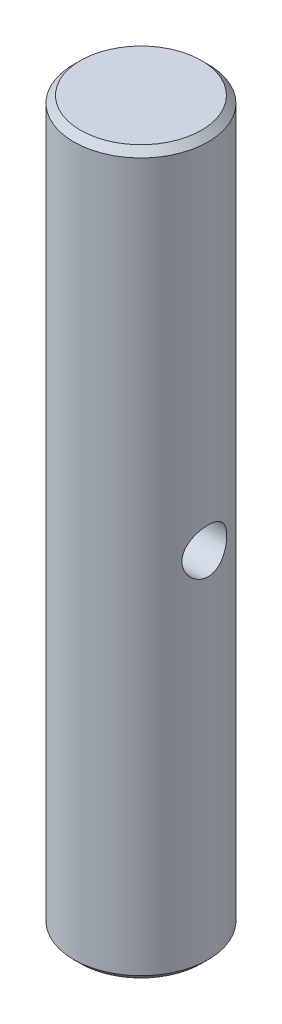
ISO-10303-21;
HEADER;
FILE_DESCRIPTION(('STEP AP214'),'2;1');
FILE_NAME('part.step','',(''),(''),'','','');
FILE_SCHEMA(('AUTOMOTIVE_DESIGN { 1 0 10303 214 1 1 1 1 }'));
ENDSEC;
DATA;
#1=APPLICATION_CONTEXT('core data for automotive mechanical design processes');
#2=APPLICATION_PROTOCOL_DEFINITION('international standard','automotive_design',2000,#1);
#3=PRODUCT_CONTEXT('',#1,'mechanical');
#4=PRODUCT('Part','Part','',(#3));
#5=PRODUCT_RELATED_PRODUCT_CATEGORY('part','',(#4));
#6=PRODUCT_DEFINITION_FORMATION('','',#4);
#7=PRODUCT_DEFINITION_CONTEXT('part definition',#1,'design');
#8=PRODUCT_DEFINITION('design','',#6,#7);
#9=PRODUCT_DEFINITION_SHAPE('','',#8);
#10=(LENGTH_UNIT() NAMED_UNIT(*) SI_UNIT(.MILLI.,.METRE.));
#11=(NAMED_UNIT(*) PLANE_ANGLE_UNIT() SI_UNIT($,.RADIAN.));
#12=(NAMED_UNIT(*) SI_UNIT($,.STERADIAN.) SOLID_ANGLE_UNIT());
#13=UNCERTAINTY_MEASURE_WITH_UNIT(LENGTH_MEASURE(1.E-05),#10,'distance_accuracy_value','');
#14=(GEOMETRIC_REPRESENTATION_CONTEXT(3) GLOBAL_UNCERTAINTY_ASSIGNED_CONTEXT((#13)) GLOBAL_UNIT_ASSIGNED_CONTEXT((#10,
#11,#12)) REPRESENTATION_CONTEXT('',''));
#15=CARTESIAN_POINT('',(0.,0.,0.));
#16=DIRECTION('',(0.,0.,1.));
#17=DIRECTION('',(1.,0.,0.));
#18=AXIS2_PLACEMENT_3D('',#15,#16,#17);
#19=CARTESIAN_POINT('',(0.,80.5,0.));
#20=DIRECTION('',(0.,-1.,0.));
#21=DIRECTION('',(0.,0.,-1.));
#22=AXIS2_PLACEMENT_3D('',#19,#20,#21);
#23=CYLINDRICAL_SURFACE('',#22,7.495);
#24=CARTESIAN_POINT('',(0.,0.750000000000015,0.));
#25=DIRECTION('',(0.,1.,0.));
#26=DIRECTION('',(0.,0.,1.));
#27=AXIS2_PLACEMENT_3D('',#24,#25,#26);
#28=CIRCLE('',#27,7.495);
#29=CARTESIAN_POINT('',(0.,0.750000000000015,7.495));
#30=VERTEX_POINT('',#29);
#31=EDGE_CURVE('E59',#30,#30,#28,.T.);
#32=ORIENTED_EDGE('',*,*,#31,.T.);
#33=EDGE_LOOP('',(#32));
#34=FACE_BOUND('',#33,.T.);
#35=CARTESIAN_POINT('',(0.,79.75,0.));
#36=DIRECTION('',(0.,1.,0.));
#37=DIRECTION('',(0.,0.,1.));
#38=AXIS2_PLACEMENT_3D('',#35,#36,#37);
#39=CIRCLE('',#38,7.495);
#40=CARTESIAN_POINT('',(0.,79.75,7.495));
#41=VERTEX_POINT('',#40);
#42=EDGE_CURVE('E64',#41,#41,#39,.F.);
#43=ORIENTED_EDGE('',*,*,#42,.T.);
#44=EDGE_LOOP('',(#43));
#45=FACE_BOUND('',#44,.T.);
#46=CARTESIAN_POINT('',(-7.495,37.75,0.));
#47=CARTESIAN_POINT('',(-7.49500039565531,37.7499993475431,-0.136403250609136));
#48=CARTESIAN_POINT('',(-7.49124202553133,37.7611998126953,-0.272802527120755));
#49=CARTESIAN_POINT('',(-7.47661940882001,37.805568395152,-0.541583183667757));
#50=CARTESIAN_POINT('',(-7.4657544339269,37.8387387640012,-0.673964150439741));
#51=CARTESIAN_POINT('',(-7.43809909299872,37.9257834362061,-0.930794409536697));
#52=CARTESIAN_POINT('',(-7.42131864383307,37.9796231023296,-1.05525656746104));
#53=CARTESIAN_POINT('',(-7.38354494520433,38.1063214058876,-1.29338434155467));
#54=CARTESIAN_POINT('',(-7.36255086316938,38.1791838028814,-1.4070478174622));
#55=CARTESIAN_POINT('',(-7.31774496789562,38.3445125147862,-1.6242929207204));
#56=CARTESIAN_POINT('',(-7.29386559549508,38.4375203683709,-1.7274484098229));
#57=CARTESIAN_POINT('',(-7.24635197972573,38.6393484438588,-1.91702313950987));
#58=CARTESIAN_POINT('',(-7.22271779151966,38.74817214483,-2.00343868796788));
#59=CARTESIAN_POINT('',(-7.17762688928455,38.9823809733002,-2.15951452446902));
#60=CARTESIAN_POINT('',(-7.15625248553374,39.1081527951714,-2.22862060979651));
#61=CARTESIAN_POINT('',(-7.11912858064474,39.3703614687983,-2.34451785614898));
#62=CARTESIAN_POINT('',(-7.10337736073673,39.5067950461376,-2.39131583728808));
#63=CARTESIAN_POINT('',(-7.07999469504405,39.7816084753698,-2.45966939771876));
#64=CARTESIAN_POINT('',(-7.07210717097534,39.9197672696434,-2.48202353193154));
#65=CARTESIAN_POINT('',(-7.0645875935002,40.1980823940866,-2.50335119104385));
#66=CARTESIAN_POINT('',(-7.06495298501804,40.3382380925919,-2.50233195226192));
#67=CARTESIAN_POINT('',(-7.07367356144509,40.6097551458046,-2.4775617832234));
#68=CARTESIAN_POINT('',(-7.08166231159511,40.7412254182891,-2.45485335071247));
#69=CARTESIAN_POINT('',(-7.10412982523248,40.9983706891034,-2.38905018795952));
#70=CARTESIAN_POINT('',(-7.11860936671825,41.1240449907251,-2.34595301385037));
#71=CARTESIAN_POINT('',(-7.15268788708642,41.3683981832486,-2.23991385200565));
#72=CARTESIAN_POINT('',(-7.17236562809782,41.4869316526036,-2.17666316736084));
#73=CARTESIAN_POINT('',(-7.21459040212254,41.7120318201852,-2.03232675645534));
#74=CARTESIAN_POINT('',(-7.23713826400811,41.8185950446809,-1.95123587311427));
#75=CARTESIAN_POINT('',(-7.28400398405308,42.0225872545359,-1.76851532622977));
#76=CARTESIAN_POINT('',(-7.3083527488286,42.1192474086212,-1.66603351202204));
#77=CARTESIAN_POINT('',(-7.35504563032165,42.2942104011091,-1.44601532622199));
#78=CARTESIAN_POINT('',(-7.37738955413792,42.3725114742091,-1.32847750861073));
#79=CARTESIAN_POINT('',(-7.41784918989191,42.5091537539704,-1.08005142286218));
#80=CARTESIAN_POINT('',(-7.43592064115018,42.5672887098801,-0.949042006439704));
#81=CARTESIAN_POINT('',(-7.46547779062344,42.6604565461127,-0.678356164359914));
#82=CARTESIAN_POINT('',(-7.47696577954708,42.6954974626196,-0.538682772093433));
#83=CARTESIAN_POINT('',(-7.49168203239221,42.7401198611464,-0.261142306321947));
#84=CARTESIAN_POINT('',(-7.49524711338938,42.7507402294888,-0.123459898112307));
#85=CARTESIAN_POINT('',(-7.49472619628961,42.7491797522535,0.151747325850034));
#86=CARTESIAN_POINT('',(-7.49064149160616,42.7370027612168,0.289272164310523));
#87=CARTESIAN_POINT('',(-7.47550226197524,42.6910150938463,0.556100709182818));
#88=CARTESIAN_POINT('',(-7.46465338508686,42.6578423081321,0.685527173003408));
#89=CARTESIAN_POINT('',(-7.43728433435304,42.5716024573964,0.936925356850375));
#90=CARTESIAN_POINT('',(-7.42076343713239,42.5185328547756,1.05889612368369));
#91=CARTESIAN_POINT('',(-7.38318641458212,42.3924571906792,1.29549957426582));
#92=CARTESIAN_POINT('',(-7.36202235541093,42.318963112025,1.40985458269083));
#93=CARTESIAN_POINT('',(-7.31755810689061,42.1546979886082,1.62494647569878));
#94=CARTESIAN_POINT('',(-7.29425726551546,42.0639216611196,1.72567918015936));
#95=CARTESIAN_POINT('',(-7.24680155790143,41.8627836195018,1.91543717007265));
#96=CARTESIAN_POINT('',(-7.22265607296265,41.7517186922413,2.00372121182836));
#97=CARTESIAN_POINT('',(-7.17732452119729,41.5158327726645,2.16049046495325));
#98=CARTESIAN_POINT('',(-7.15613847996424,41.3910116614004,2.22897550510456));
#99=CARTESIAN_POINT('',(-7.11933100196057,41.1310984054223,2.34388694582545));
#100=CARTESIAN_POINT('',(-7.10369846070152,40.9960274200524,2.39035742835481));
#101=CARTESIAN_POINT('',(-7.0799966164816,40.7193351121137,2.45968318315295));
#102=CARTESIAN_POINT('',(-7.07192390042893,40.5777167758617,2.48254911282648));
#103=CARTESIAN_POINT('',(-7.06464418608981,40.2997876035332,2.50318491056864));
#104=CARTESIAN_POINT('',(-7.06500248050563,40.1635785003749,2.50218525976918));
#105=CARTESIAN_POINT('',(-7.07346944390389,39.893377080663,2.47814722342207));
#106=CARTESIAN_POINT('',(-7.08157765042908,39.7593846323212,2.45511015290403));
#107=CARTESIAN_POINT('',(-7.10430697185424,39.4999593088065,2.38852265250878));
#108=CARTESIAN_POINT('',(-7.11880111522782,39.3744120211648,2.34537123105761));
#109=CARTESIAN_POINT('',(-7.15262215966858,39.132243480001,2.24010341320802));
#110=CARTESIAN_POINT('',(-7.17195013417403,39.0156242166288,2.17798280368561));
#111=CARTESIAN_POINT('',(-7.21431366189938,38.7891002781729,2.03337362171154));
#112=CARTESIAN_POINT('',(-7.23747429225665,38.6797114557464,1.95011384915057));
#113=CARTESIAN_POINT('',(-7.28436994106761,38.476060688924,1.76689301877659));
#114=CARTESIAN_POINT('',(-7.30810512039808,38.3818030390629,1.66692723583099));
#115=CARTESIAN_POINT('',(-7.35458808165459,38.2073807635579,1.44844508549721));
#116=CARTESIAN_POINT('',(-7.37726112501435,38.1279101050329,1.32935680553727));
#117=CARTESIAN_POINT('',(-7.4180437841934,37.9902013360198,1.07876542219285));
#118=CARTESIAN_POINT('',(-7.43615455915789,37.9319578306203,0.94726548396046));
#119=CARTESIAN_POINT('',(-7.46508892700444,37.8407849450904,0.681562196295865));
#120=CARTESIAN_POINT('',(-7.47619944556791,37.8068497079358,0.547735781087238));
#121=CARTESIAN_POINT('',(-7.49115377480986,37.7614606812882,0.275937448740938));
#122=CARTESIAN_POINT('',(-7.49499959980972,37.7500006599353,0.137966691509938));
#123=CARTESIAN_POINT('',(-7.495,37.75,0.));
#124=B_SPLINE_CURVE_WITH_KNOTS('',3,(#46,#47,#48,#49,#50,#51,#52,#53,#54,#55,#56,#57,#58,#59,
#60,#61,#62,#63,#64,#65,#66,#67,#68,#69,#70,#71,#72,#73,#74,#75,#76,#77,#78,#79,#80,#81,#82,#83,
#84,#85,#86,#87,#88,#89,#90,#91,#92,#93,#94,#95,#96,#97,#98,#99,#100,#101,#102,#103,#104,#105,
#106,#107,#108,#109,#110,#111,#112,#113,#114,#115,#116,#117,#118,#119,#120,#121,#122,#123),
.UNSPECIFIED.,.T.,.F.,(4,2,2,2,2,2,2,2,2,2,2,2,2,2,2,2,2,2,2,2,2,2,2,2,2,2,2,2,2,2,2,2,2,2,2,2,
2,2,4),(0.,0.40870203817066,0.817445967892821,1.22550790100636,1.63365054260894,
2.05454956517894,2.47554131492762,2.90865713703534,3.34164046035242,3.76001197515197,
4.17825396527142,4.57735424663798,4.9765023777096,5.38208472266918,5.78778446404979,
6.21469488453949,6.64164633743611,7.07284393497927,7.50389140654312,7.91623240741195,
8.32850369662022,8.72881408232289,9.12917554017089,9.54007575277906,9.95110176895632,
10.3808297494757,10.8105614460871,11.239428972036,11.6681027804197,12.0747247664217,
12.4813224897559,12.8801770218289,13.2791202054223,13.695490563237,14.1119788872947,
14.5447291545869,14.9773693609554,15.3908705730491,15.8042571145572),.UNSPECIFIED.);
#125=CARTESIAN_POINT('',(-7.495,37.75,0.));
#126=VERTEX_POINT('',#125);
#127=EDGE_CURVE('E70',#126,#126,#124,.T.);
#128=ORIENTED_EDGE('',*,*,#127,.T.);
#129=EDGE_LOOP('',(#128));
#130=FACE_BOUND('',#129,.T.);
#131=CARTESIAN_POINT('',(7.06576428986985,40.25,-2.5));
#132=CARTESIAN_POINT('',(7.0657638249131,40.1138353486714,-2.50000066362457));
#133=CARTESIAN_POINT('',(7.06974335597971,39.9776747189488,-2.48883791001409));
#134=CARTESIAN_POINT('',(7.08514864170734,39.7093877235982,-2.44463272735069));
#135=CARTESIAN_POINT('',(7.09657561467055,39.5772620217334,-2.41158671847479));
#136=CARTESIAN_POINT('',(7.12544058293644,39.3209749881567,-2.32490516495711));
#137=CARTESIAN_POINT('',(7.14286677809783,39.1967985850399,-2.27131001598819));
#138=CARTESIAN_POINT('',(7.18174951835662,38.9591595961731,-2.14518949792188));
#139=CARTESIAN_POINT('',(7.20320695425731,38.8456993867769,-2.07265994341225));
#140=CARTESIAN_POINT('',(7.24867725880278,38.6282681876395,-1.90768556996842));
#141=CARTESIAN_POINT('',(7.27275387320441,38.5247782393971,-1.81462416717895));
#142=CARTESIAN_POINT('',(7.32021090555531,38.3345458563827,-1.61254360835079));
#143=CARTESIAN_POINT('',(7.34359121102593,38.2478061150869,-1.50352189079965));
#144=CARTESIAN_POINT('',(7.38775946665619,38.0913529529184,-1.2690969922347));
#145=CARTESIAN_POINT('',(7.40846371507817,38.022143653469,-1.14334020120049));
#146=CARTESIAN_POINT('',(7.44419586373357,37.906051828611,-0.881160591084556));
#147=CARTESIAN_POINT('',(7.45922529571979,37.8591632774687,-0.74474066222611));
#148=CARTESIAN_POINT('',(7.48146286131244,37.7906755197199,-0.470150891741198));
#149=CARTESIAN_POINT('',(7.4889252198773,37.7682522312938,-0.332207563932205));
#150=CARTESIAN_POINT('',(7.49609030598823,37.7467111283003,-0.0543279448844862));
#151=CARTESIAN_POINT('',(7.49579503617113,37.7475872989631,0.0856078226818821));
#152=CARTESIAN_POINT('',(7.48765034999541,37.7720977708136,0.357666666584124));
#153=CARTESIAN_POINT('',(7.48009806003232,37.7948369496504,0.489880739484106));
#154=CARTESIAN_POINT('',(7.4586610507061,37.8609475549255,0.748495711587776));
#155=CARTESIAN_POINT('',(7.44477590202233,37.9043203801797,0.874896216035203));
#156=CARTESIAN_POINT('',(7.41185515005991,38.0109891825239,1.12025209520925));
#157=CARTESIAN_POINT('',(7.39275420514729,38.0745397047006,1.23908767700572));
#158=CARTESIAN_POINT('',(7.35138975525784,38.2195500348621,1.46467246163601));
#159=CARTESIAN_POINT('',(7.32912537066374,38.3010148275015,1.57141828793993));
#160=CARTESIAN_POINT('',(7.28254196420155,38.484050760255,1.77511749844454));
#161=CARTESIAN_POINT('',(7.25817556221889,38.5863886912503,1.87137204724271));
#162=CARTESIAN_POINT('',(7.21101902945478,38.8059607289922,2.04557930233335));
#163=CARTESIAN_POINT('',(7.18822914265605,38.9231971335084,2.12352918023092));
#164=CARTESIAN_POINT('',(7.14654651176829,39.1714556562888,2.25988371021088));
#165=CARTESIAN_POINT('',(7.12771412183756,39.3026508556494,2.31799309450249));
#166=CARTESIAN_POINT('',(7.09677790884438,39.5737501877954,2.41105823153615));
#167=CARTESIAN_POINT('',(7.08467126166414,39.7136506377918,2.44602370351534));
#168=CARTESIAN_POINT('',(7.06919649298177,39.9914194542844,2.49038474996967));
#169=CARTESIAN_POINT('',(7.06545835909857,40.1290941743889,2.50086396016862));
#170=CARTESIAN_POINT('',(7.06610957550233,40.4042569020076,2.49902480943983));
#171=CARTESIAN_POINT('',(7.07049744707572,40.5417449389369,2.48671059629991));
#172=CARTESIAN_POINT('',(7.08653737214327,40.8076984524668,2.44060788060447));
#173=CARTESIAN_POINT('',(7.09793424979986,40.9363116017635,2.40757294763833));
#174=CARTESIAN_POINT('',(7.12642723414446,41.1861432086363,2.32187103564908));
#175=CARTESIAN_POINT('',(7.14352435197788,41.3073603497444,2.26920057335292));
#176=CARTESIAN_POINT('',(7.18216354797652,41.5432243116644,2.14382212524103));
#177=CARTESIAN_POINT('',(7.20382951821319,41.6575403322883,2.07053104543611));
#178=CARTESIAN_POINT('',(7.24892494119859,41.8726430741348,1.90665244660716));
#179=CARTESIAN_POINT('',(7.27235491322546,41.9734257869941,1.81605982228464));
#180=CARTESIAN_POINT('',(7.31970404970355,42.1636203800063,1.61496581095641));
#181=CARTESIAN_POINT('',(7.34359238440693,42.2522503370852,1.50371544557538));
#182=CARTESIAN_POINT('',(7.38805332523748,42.4096344897886,1.26733393837867));
#183=CARTESIAN_POINT('',(7.40862604866459,42.4783893886226,1.14220328788531));
#184=CARTESIAN_POINT('',(7.44404231903935,42.593443681612,0.882233268701645));
#185=CARTESIAN_POINT('',(7.45892296281636,42.6398889994588,0.747463803968296));
#186=CARTESIAN_POINT('',(7.4814381746219,42.7092646279449,0.471432873399999));
#187=CARTESIAN_POINT('',(7.48907536203804,42.7322034392777,0.330173773743843));
#188=CARTESIAN_POINT('',(7.49604519494219,42.7531490034189,0.0523250862054023));
#189=CARTESIAN_POINT('',(7.49575172613707,42.7522782204196,-0.0841714244261025));
#190=CARTESIAN_POINT('',(7.48781405390141,42.7283987902247,-0.354982894905725));
#191=CARTESIAN_POINT('',(7.48017044813738,42.7053919429932,-0.489298031226364));
#192=CARTESIAN_POINT('',(7.45852855962949,42.6386382667877,-0.749804746218207));
#193=CARTESIAN_POINT('',(7.44463339918322,42.595227509843,-0.876091621080472));
#194=CARTESIAN_POINT('',(7.4119194842851,42.4892095956423,-1.11963792699995));
#195=CARTESIAN_POINT('',(7.39309983888355,42.4265989643458,-1.23689571952014));
#196=CARTESIAN_POINT('',(7.35160945822824,42.2812933783982,-1.46378308806134));
#197=CARTESIAN_POINT('',(7.32882204529842,42.1979413228743,-1.57297021608781));
#198=CARTESIAN_POINT('',(7.28224680101563,42.0146363294614,-1.77617403005855));
#199=CARTESIAN_POINT('',(7.25845865207907,41.9146780914658,-1.87018585363334));
#200=CARTESIAN_POINT('',(7.21145294100346,41.6963115764664,-2.04411761007421));
#201=CARTESIAN_POINT('',(7.18829432987973,41.577333526228,-2.12334041246333));
#202=CARTESIAN_POINT('',(7.14631663626124,41.3270315783797,-2.26061082476856));
#203=CARTESIAN_POINT('',(7.12749642751891,41.1957108974017,-2.31866393261157));
#204=CARTESIAN_POINT('',(7.09728363830651,40.930421307376,-2.40952129105973));
#205=CARTESIAN_POINT('',(7.0855963079879,40.7968340151331,-2.44333935505963));
#206=CARTESIAN_POINT('',(7.06983818773535,40.5254954709032,-2.48857449514714));
#207=CARTESIAN_POINT('',(7.06576476022528,40.3877456776822,-2.49999932867));
#208=CARTESIAN_POINT('',(7.06576428986985,40.25,-2.5));
#209=B_SPLINE_CURVE_WITH_KNOTS('',3,(#131,#132,#133,#134,#135,#136,#137,#138,#139,#140,#141,
#142,#143,#144,#145,#146,#147,#148,#149,#150,#151,#152,#153,#154,#155,#156,#157,#158,#159,#160,
#161,#162,#163,#164,#165,#166,#167,#168,#169,#170,#171,#172,#173,#174,#175,#176,#177,#178,#179,
#180,#181,#182,#183,#184,#185,#186,#187,#188,#189,#190,#191,#192,#193,#194,#195,#196,#197,#198,
#199,#200,#201,#202,#203,#204,#205,#206,#207,#208),.UNSPECIFIED.,.T.,.F.,(4,2,2,2,2,2,2,2,2,2,2,
2,2,2,2,2,2,2,2,2,2,2,2,2,2,2,2,2,2,2,2,2,2,2,2,2,2,2,4),(0.,0.407983839677388,
0.816034436828779,1.22328696364479,1.63062958915006,2.05246040074208,2.47435898742989,
2.90728177986198,3.34008763361042,3.7578161905301,4.17543691161022,4.57665658036221,
4.97790345286161,5.38442791331314,5.79106563284839,6.21687248556903,6.64274508973781,
7.07470436849436,7.5064821315792,7.91875679141333,8.33095643576262,8.72897120693647,
9.12705661813873,9.53778118713994,9.94862713954636,10.3792701480633,10.8098979179132,
11.237669307446,11.6652859467155,12.0727796452682,12.4802402118201,12.8812128577835,
13.2822580989054,13.6981340945333,14.1141430789907,14.5464647719052,14.9786741075672,
15.3915381524471,15.8042591481785),.UNSPECIFIED.);
#210=CARTESIAN_POINT('',(7.06576428986985,40.25,-2.5));
#211=VERTEX_POINT('',#210);
#212=EDGE_CURVE('E79',#211,#211,#209,.T.);
#213=ORIENTED_EDGE('',*,*,#212,.T.);
#214=EDGE_LOOP('',(#213));
#215=FACE_BOUND('',#214,.T.);
#216=ADVANCED_FACE('F45',(#34,#45,#130,#215),#23,.T.);
#217=CARTESIAN_POINT('',(0.,80.5,0.));
#218=DIRECTION('',(0.,1.,0.));
#219=DIRECTION('',(0.,0.,1.));
#220=AXIS2_PLACEMENT_3D('',#217,#218,#219);
#221=PLANE('',#220);
#222=CARTESIAN_POINT('',(0.,80.5,0.));
#223=DIRECTION('',(0.,1.,0.));
#224=DIRECTION('',(0.,0.,1.));
#225=AXIS2_PLACEMENT_3D('',#222,#223,#224);
#226=CIRCLE('',#225,6.74500000000002);
#227=CARTESIAN_POINT('',(0.,80.5,6.74500000000002));
#228=VERTEX_POINT('',#227);
#229=EDGE_CURVE('E10',#228,#228,#226,.T.);
#230=ORIENTED_EDGE('',*,*,#229,.T.);
#231=EDGE_LOOP('',(#230));
#232=FACE_BOUND('',#231,.T.);
#233=ADVANCED_FACE('F92',(#232),#221,.T.);
#234=CARTESIAN_POINT('',(0.,0.,0.));
#235=DIRECTION('',(0.,1.,0.));
#236=DIRECTION('',(0.,0.,1.));
#237=AXIS2_PLACEMENT_3D('',#234,#235,#236);
#238=PLANE('',#237);
#239=CARTESIAN_POINT('',(0.,0.,0.));
#240=DIRECTION('',(0.,1.,0.));
#241=DIRECTION('',(0.,0.,1.));
#242=AXIS2_PLACEMENT_3D('',#239,#240,#241);
#243=CIRCLE('',#242,6.74499999999998);
#244=CARTESIAN_POINT('',(0.,0.,6.74499999999998));
#245=VERTEX_POINT('',#244);
#246=EDGE_CURVE('E54',#245,#245,#243,.F.);
#247=ORIENTED_EDGE('',*,*,#246,.T.);
#248=EDGE_LOOP('',(#247));
#249=FACE_BOUND('',#248,.T.);
#250=ADVANCED_FACE('F90',(#249),#238,.F.);
#251=CARTESIAN_POINT('',(-7.495,40.25,0.));
#252=DIRECTION('',(1.,0.,0.));
#253=DIRECTION('',(0.,0.,-1.));
#254=AXIS2_PLACEMENT_3D('',#251,#252,#253);
#255=CYLINDRICAL_SURFACE('',#254,2.5);
#256=ORIENTED_EDGE('',*,*,#212,.F.);
#257=EDGE_LOOP('',(#256));
#258=FACE_BOUND('',#257,.T.);
#259=ORIENTED_EDGE('',*,*,#127,.F.);
#260=EDGE_LOOP('',(#259));
#261=FACE_BOUND('',#260,.T.);
#262=ADVANCED_FACE('F85',(#258,#261),#255,.F.);
#263=CARTESIAN_POINT('',(0.,0.750000000000015,0.));
#264=DIRECTION('',(0.,1.,0.));
#265=DIRECTION('',(0.,0.,1.));
#266=AXIS2_PLACEMENT_3D('',#263,#264,#265);
#267=CONICAL_SURFACE('',#266,7.495,0.785398163397452);
#268=ORIENTED_EDGE('',*,*,#246,.F.);
#269=EDGE_LOOP('',(#268));
#270=FACE_BOUND('',#269,.T.);
#271=ORIENTED_EDGE('',*,*,#31,.F.);
#272=EDGE_LOOP('',(#271));
#273=FACE_BOUND('',#272,.T.);
#274=ADVANCED_FACE('F89',(#270,#273),#267,.T.);
#275=CARTESIAN_POINT('',(0.,80.5,0.));
#276=DIRECTION('',(0.,-1.,0.));
#277=DIRECTION('',(0.,0.,-1.));
#278=AXIS2_PLACEMENT_3D('',#275,#276,#277);
#279=CONICAL_SURFACE('',#278,6.74500000000002,0.785398163397443);
#280=ORIENTED_EDGE('',*,*,#42,.F.);
#281=EDGE_LOOP('',(#280));
#282=FACE_BOUND('',#281,.T.);
#283=ORIENTED_EDGE('',*,*,#229,.F.);
#284=EDGE_LOOP('',(#283));
#285=FACE_BOUND('',#284,.T.);
#286=ADVANCED_FACE('F48',(#282,#285),#279,.T.);
#287=CLOSED_SHELL('',(#216,#233,#250,#262,#274,#286));
#288=MANIFOLD_SOLID_BREP('B2',#287);
#289=ADVANCED_BREP_SHAPE_REPRESENTATION('',(#18,#288),#14);
#290=SHAPE_DEFINITION_REPRESENTATION(#9,#289);
ENDSEC;
END-ISO-10303-21;
